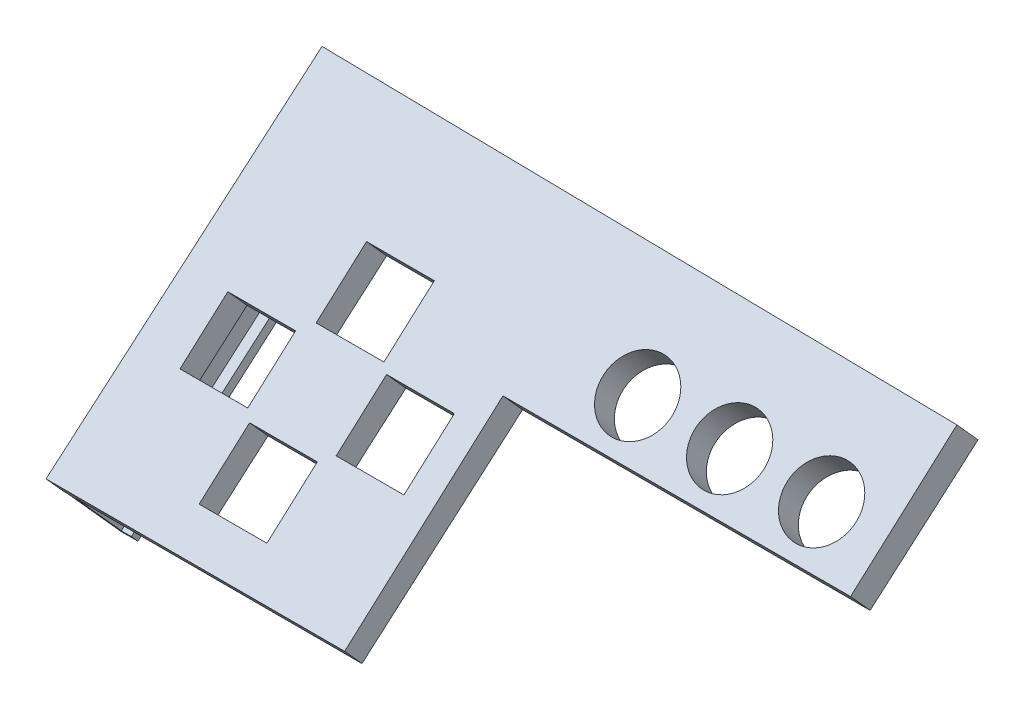
ISO-10303-21;
HEADER;
FILE_DESCRIPTION(('STEP AP214'),'2;1');
FILE_NAME('part.step','',(''),(''),'','','');
FILE_SCHEMA(('AUTOMOTIVE_DESIGN { 1 0 10303 214 1 1 1 1 }'));
ENDSEC;
DATA;
#1=APPLICATION_CONTEXT('core data for automotive mechanical design processes');
#2=APPLICATION_PROTOCOL_DEFINITION('international standard','automotive_design',2000,#1);
#3=PRODUCT_CONTEXT('',#1,'mechanical');
#4=PRODUCT('Part','Part','',(#3));
#5=PRODUCT_RELATED_PRODUCT_CATEGORY('part','',(#4));
#6=PRODUCT_DEFINITION_FORMATION('','',#4);
#7=PRODUCT_DEFINITION_CONTEXT('part definition',#1,'design');
#8=PRODUCT_DEFINITION('design','',#6,#7);
#9=PRODUCT_DEFINITION_SHAPE('','',#8);
#10=(LENGTH_UNIT() NAMED_UNIT(*) SI_UNIT(.MILLI.,.METRE.));
#11=(NAMED_UNIT(*) PLANE_ANGLE_UNIT() SI_UNIT($,.RADIAN.));
#12=(NAMED_UNIT(*) SI_UNIT($,.STERADIAN.) SOLID_ANGLE_UNIT());
#13=UNCERTAINTY_MEASURE_WITH_UNIT(LENGTH_MEASURE(1.E-05),#10,'distance_accuracy_value','');
#14=(GEOMETRIC_REPRESENTATION_CONTEXT(3) GLOBAL_UNCERTAINTY_ASSIGNED_CONTEXT((#13)) GLOBAL_UNIT_ASSIGNED_CONTEXT((#10,
#11,#12)) REPRESENTATION_CONTEXT('',''));
#15=CARTESIAN_POINT('',(0.,0.,0.));
#16=DIRECTION('',(0.,0.,1.));
#17=DIRECTION('',(1.,0.,0.));
#18=AXIS2_PLACEMENT_3D('',#15,#16,#17);
#19=CARTESIAN_POINT('',(253.811392064802,66.7836197317114,88.641700653962));
#20=DIRECTION('',(0.,0.754738656539461,0.656025579017319));
#21=DIRECTION('',(0.,-0.656025579017319,0.754738656539462));
#22=AXIS2_PLACEMENT_3D('',#19,#20,#21);
#23=PLANE('',#22);
#24=DIRECTION('',(-0.0161096728568578,-0.655940447102882,0.754640714707944));
#25=VECTOR('',#24,1.);
#26=CARTESIAN_POINT('',(184.643368262529,67.514707004922,87.8006056661377));
#27=LINE('',#26,#25);
#28=CARTESIAN_POINT('',(184.37843120733,56.7272172783893,100.21130391335));
#29=VERTEX_POINT('',#28);
#30=CARTESIAN_POINT('',(183.933086898354,38.594052952829,121.072990590847));
#31=VERTEX_POINT('',#30);
#32=EDGE_CURVE('E268',#29,#31,#27,.T.);
#33=ORIENTED_EDGE('',*,*,#32,.F.);
#34=DIRECTION('',(0.,0.656025579017319,-0.754738656539461));
#35=VECTOR('',#34,1.);
#36=CARTESIAN_POINT('',(184.37843120733,30.4009789206237,130.498887820734));
#37=LINE('',#36,#35);
#38=CARTESIAN_POINT('',(184.37843120733,38.5387104513235,121.136660555207));
#39=VERTEX_POINT('',#38);
#40=EDGE_CURVE('E435',#39,#29,#37,.T.);
#41=ORIENTED_EDGE('',*,*,#40,.F.);
#42=DIRECTION('',(1.,0.,0.));
#43=VECTOR('',#42,1.);
#44=CARTESIAN_POINT('',(253.811392064802,38.5387104513235,121.136660555207));
#45=LINE('',#44,#43);
#46=CARTESIAN_POINT('',(183.932173865189,38.5387104513235,121.136660555207));
#47=VERTEX_POINT('',#46);
#48=EDGE_CURVE('E275',#47,#39,#45,.T.);
#49=ORIENTED_EDGE('',*,*,#48,.F.);
#50=DIRECTION('',(-0.0108223881525253,-0.655987159694383,0.75469445620779));
#51=VECTOR('',#50,1.);
#52=CARTESIAN_POINT('',(184.406284551071,67.2764084371243,88.0747613494943));
#53=LINE('',#52,#51);
#54=EDGE_CURVE('E306',#31,#47,#53,.T.);
#55=ORIENTED_EDGE('',*,*,#54,.F.);
#56=EDGE_LOOP('',(#33,#41,#49,#55));
#57=FACE_BOUND('',#56,.T.);
#58=ADVANCED_FACE('F46',(#57),#23,.F.);
#59=CARTESIAN_POINT('',(251.62843120733,31.4929526378121,129.242603305851));
#60=DIRECTION('',(0.,0.754738656539461,0.656025579017319));
#61=DIRECTION('',(0.,-0.656025579017319,0.754738656539462));
#62=AXIS2_PLACEMENT_3D('',#59,#60,#61);
#63=PLANE('',#62);
#64=CARTESIAN_POINT('',(233.445359997497,55.8234951262214,101.251010389481));
#65=DIRECTION('',(0.,0.754738656539461,0.656025579017319));
#66=DIRECTION('',(0.,-0.656025579017319,0.754738656539462));
#67=AXIS2_PLACEMENT_3D('',#64,#65,#66);
#68=ELLIPSE('',#67,3.50043164958809,3.50000000000002);
#69=CARTESIAN_POINT('',(233.445359997497,53.5271224264898,103.89292147));
#70=VERTEX_POINT('',#69);
#71=EDGE_CURVE('E348',#70,#70,#68,.F.);
#72=ORIENTED_EDGE('',*,*,#71,.F.);
#73=EDGE_LOOP('',(#72));
#74=FACE_BOUND('',#73,.T.);
#75=DIRECTION('',(-1.,0.,0.));
#76=VECTOR('',#75,1.);
#77=CARTESIAN_POINT('',(253.811392064802,50.4249263144399,107.461909327817));
#78=LINE('',#77,#76);
#79=CARTESIAN_POINT('',(195.683649821769,50.4249263144399,107.461909327817));
#80=VERTEX_POINT('',#79);
#81=CARTESIAN_POINT('',(188.833649821769,50.4249263144399,107.461909327817));
#82=VERTEX_POINT('',#81);
#83=EDGE_CURVE('E318',#80,#82,#78,.T.);
#84=ORIENTED_EDGE('',*,*,#83,.T.);
#85=DIRECTION('',(0.,-0.656025579017319,0.754738656539462));
#86=VECTOR('',#85,1.);
#87=CARTESIAN_POINT('',(188.833649821769,66.7836197317114,88.641700653962));
#88=LINE('',#87,#86);
#89=CARTESIAN_POINT('',(188.833649821769,46.1602341577956,112.368315620208));
#90=VERTEX_POINT('',#89);
#91=EDGE_CURVE('E316',#82,#90,#88,.T.);
#92=ORIENTED_EDGE('',*,*,#91,.T.);
#93=DIRECTION('',(1.,0.,0.));
#94=VECTOR('',#93,1.);
#95=CARTESIAN_POINT('',(253.811392064802,46.1602341577956,112.368315620208));
#96=LINE('',#95,#94);
#97=CARTESIAN_POINT('',(195.683649821769,46.1602341577956,112.368315620208));
#98=VERTEX_POINT('',#97);
#99=EDGE_CURVE('E314',#90,#98,#96,.T.);
#100=ORIENTED_EDGE('',*,*,#99,.T.);
#101=DIRECTION('',(0.,0.656025579017319,-0.754738656539462));
#102=VECTOR('',#101,1.);
#103=CARTESIAN_POINT('',(195.683649821769,66.7836197317114,88.641700653962));
#104=LINE('',#103,#102);
#105=EDGE_CURVE('E311',#98,#80,#104,.T.);
#106=ORIENTED_EDGE('',*,*,#105,.T.);
#107=EDGE_LOOP('',(#84,#92,#100,#106));
#108=FACE_BOUND('',#107,.T.);
#109=CARTESIAN_POINT('',(224.145359997497,55.8234951262214,101.251010389481));
#110=DIRECTION('',(0.,0.754738656539461,0.656025579017319));
#111=DIRECTION('',(0.,-0.656025579017319,0.754738656539462));
#112=AXIS2_PLACEMENT_3D('',#109,#110,#111);
#113=ELLIPSE('',#112,3.50043164958812,3.50000000000005);
#114=CARTESIAN_POINT('',(224.145359997497,53.5271224264898,103.89292147));
#115=VERTEX_POINT('',#114);
#116=EDGE_CURVE('E396',#115,#115,#113,.F.);
#117=ORIENTED_EDGE('',*,*,#116,.F.);
#118=EDGE_LOOP('',(#117));
#119=FACE_BOUND('',#118,.T.);
#120=DIRECTION('',(1.,0.,0.));
#121=VECTOR('',#120,1.);
#122=CARTESIAN_POINT('',(253.811392064802,41.1082142183861,118.180519997348));
#123=LINE('',#122,#121);
#124=CARTESIAN_POINT('',(196.499532192024,41.1082142183861,118.180519997348));
#125=VERTEX_POINT('',#124);
#126=CARTESIAN_POINT('',(203.349532192024,41.1082142183862,118.180519997348));
#127=VERTEX_POINT('',#126);
#128=EDGE_CURVE('E313',#125,#127,#123,.T.);
#129=ORIENTED_EDGE('',*,*,#128,.T.);
#130=DIRECTION('',(0.,0.656025579017319,-0.754738656539462));
#131=VECTOR('',#130,1.);
#132=CARTESIAN_POINT('',(203.349532192024,66.7836197317114,88.641700653962));
#133=LINE('',#132,#131);
#134=CARTESIAN_POINT('',(203.349532192024,45.6025436450036,113.009922596905));
#135=VERTEX_POINT('',#134);
#136=EDGE_CURVE('E326',#127,#135,#133,.T.);
#137=ORIENTED_EDGE('',*,*,#136,.T.);
#138=DIRECTION('',(-1.,0.,0.));
#139=VECTOR('',#138,1.);
#140=CARTESIAN_POINT('',(253.811392064802,45.6025436450036,113.009922596905));
#141=LINE('',#140,#139);
#142=CARTESIAN_POINT('',(196.499532192024,45.6025436450036,113.009922596905));
#143=VERTEX_POINT('',#142);
#144=EDGE_CURVE('E324',#135,#143,#141,.T.);
#145=ORIENTED_EDGE('',*,*,#144,.T.);
#146=DIRECTION('',(0.,-0.656025579017319,0.754738656539462));
#147=VECTOR('',#146,1.);
#148=CARTESIAN_POINT('',(196.499532192024,66.7836197317114,88.641700653962));
#149=LINE('',#148,#147);
#150=EDGE_CURVE('E321',#143,#125,#149,.T.);
#151=ORIENTED_EDGE('',*,*,#150,.T.);
#152=EDGE_LOOP('',(#129,#137,#145,#151));
#153=FACE_BOUND('',#152,.T.);
#154=DIRECTION('',(-1.,0.,0.));
#155=VECTOR('',#154,1.);
#156=CARTESIAN_POINT('',(253.811392064802,50.7857848815406,107.046751872307));
#157=LINE('',#156,#155);
#158=CARTESIAN_POINT('',(211.324532192024,50.7857848815406,107.046751872307));
#159=VERTEX_POINT('',#158);
#160=CARTESIAN_POINT('',(204.474532192024,50.7857848815406,107.046751872307));
#161=VERTEX_POINT('',#160);
#162=EDGE_CURVE('E323',#159,#161,#157,.T.);
#163=ORIENTED_EDGE('',*,*,#162,.T.);
#164=DIRECTION('',(0.,-0.656025579017319,0.754738656539462));
#165=VECTOR('',#164,1.);
#166=CARTESIAN_POINT('',(204.474532192024,66.7836197317114,88.641700653962));
#167=LINE('',#166,#165);
#168=CARTESIAN_POINT('',(204.474532192024,46.2914554549231,112.21734927275));
#169=VERTEX_POINT('',#168);
#170=EDGE_CURVE('E334',#161,#169,#167,.T.);
#171=ORIENTED_EDGE('',*,*,#170,.T.);
#172=DIRECTION('',(1.,0.,0.));
#173=VECTOR('',#172,1.);
#174=CARTESIAN_POINT('',(253.811392064802,46.2914554549231,112.21734927275));
#175=LINE('',#174,#173);
#176=CARTESIAN_POINT('',(211.324532192024,46.2914554549231,112.21734927275));
#177=VERTEX_POINT('',#176);
#178=EDGE_CURVE('E332',#169,#177,#175,.T.);
#179=ORIENTED_EDGE('',*,*,#178,.T.);
#180=DIRECTION('',(0.,0.656025579017319,-0.754738656539462));
#181=VECTOR('',#180,1.);
#182=CARTESIAN_POINT('',(211.324532192024,66.7836197317114,88.641700653962));
#183=LINE('',#182,#181);
#184=EDGE_CURVE('E329',#177,#159,#183,.T.);
#185=ORIENTED_EDGE('',*,*,#184,.T.);
#186=EDGE_LOOP('',(#163,#171,#179,#185));
#187=FACE_BOUND('',#186,.T.);
#188=DIRECTION('',(1.,0.,0.));
#189=VECTOR('',#188,1.);
#190=CARTESIAN_POINT('',(253.811392064802,51.228656759346,106.537240449636));
#191=LINE('',#190,#189);
#192=CARTESIAN_POINT('',(196.849532192024,51.228656759346,106.537240449636));
#193=VERTEX_POINT('',#192);
#194=CARTESIAN_POINT('',(203.699532192024,51.228656759346,106.537240449636));
#195=VERTEX_POINT('',#194);
#196=EDGE_CURVE('E331',#193,#195,#191,.T.);
#197=ORIENTED_EDGE('',*,*,#196,.T.);
#198=DIRECTION('',(0.,0.656025579017319,-0.754738656539462));
#199=VECTOR('',#198,1.);
#200=CARTESIAN_POINT('',(203.699532192024,66.7836197317114,88.641700653962));
#201=LINE('',#200,#199);
#202=CARTESIAN_POINT('',(203.699532192024,55.7229861859635,101.366643049193));
#203=VERTEX_POINT('',#202);
#204=EDGE_CURVE('E342',#195,#203,#201,.T.);
#205=ORIENTED_EDGE('',*,*,#204,.T.);
#206=DIRECTION('',(-1.,0.,0.));
#207=VECTOR('',#206,1.);
#208=CARTESIAN_POINT('',(253.811392064802,55.7229861859635,101.366643049193));
#209=LINE('',#208,#207);
#210=CARTESIAN_POINT('',(196.849532192024,55.7229861859635,101.366643049193));
#211=VERTEX_POINT('',#210);
#212=EDGE_CURVE('E340',#203,#211,#209,.T.);
#213=ORIENTED_EDGE('',*,*,#212,.T.);
#214=DIRECTION('',(0.,-0.656025579017319,0.754738656539462));
#215=VECTOR('',#214,1.);
#216=CARTESIAN_POINT('',(196.849532192024,66.7836197317114,88.641700653962));
#217=LINE('',#216,#215);
#218=EDGE_CURVE('E337',#211,#193,#217,.T.);
#219=ORIENTED_EDGE('',*,*,#218,.T.);
#220=EDGE_LOOP('',(#197,#205,#213,#219));
#221=FACE_BOUND('',#220,.T.);
#222=CARTESIAN_POINT('',(242.745359997497,55.8234951262214,101.251010389481));
#223=DIRECTION('',(0.,0.754738656539461,0.656025579017319));
#224=DIRECTION('',(0.,-0.656025579017319,0.754738656539462));
#225=AXIS2_PLACEMENT_3D('',#222,#223,#224);
#226=ELLIPSE('',#225,3.50043164958818,3.50000000000011);
#227=CARTESIAN_POINT('',(242.745359997496,53.5271224264897,103.89292147));
#228=VERTEX_POINT('',#227);
#229=EDGE_CURVE('E56',#228,#228,#226,.F.);
#230=ORIENTED_EDGE('',*,*,#229,.F.);
#231=EDGE_LOOP('',(#230));
#232=FACE_BOUND('',#231,.T.);
#233=DIRECTION('',(-0.999935115920679,0.00747304847752896,-0.00859752843270607));
#234=VECTOR('',#233,1.);
#235=CARTESIAN_POINT('',(252.160112408158,62.1102513995226,94.0182771920807));
#236=LINE('',#235,#234);
#237=CARTESIAN_POINT('',(249.267868371204,62.1318666819073,93.9934094282167));
#238=VERTEX_POINT('',#237);
#239=CARTESIAN_POINT('',(185.12843120733,62.6112149072227,93.441933011503));
#240=VERTEX_POINT('',#239);
#241=EDGE_CURVE('E304',#238,#240,#236,.T.);
#242=ORIENTED_EDGE('',*,*,#241,.F.);
#243=DIRECTION('',(0.,0.656025579017319,-0.754738656539462));
#244=VECTOR('',#243,1.);
#245=CARTESIAN_POINT('',(249.267868371204,31.4929526378121,129.242603305851));
#246=LINE('',#245,#244);
#247=CARTESIAN_POINT('',(249.267868371204,52.6506336429939,104.901296734754));
#248=VERTEX_POINT('',#247);
#249=EDGE_CURVE('E293',#248,#238,#246,.T.);
#250=ORIENTED_EDGE('',*,*,#249,.F.);
#251=DIRECTION('',(1.,0.,0.));
#252=VECTOR('',#251,1.);
#253=CARTESIAN_POINT('',(251.62843120733,52.6506336429939,104.901296734754));
#254=LINE('',#253,#252);
#255=CARTESIAN_POINT('',(214.126263471792,52.6506336429939,104.901296734754));
#256=VERTEX_POINT('',#255);
#257=EDGE_CURVE('E291',#256,#248,#254,.T.);
#258=ORIENTED_EDGE('',*,*,#257,.F.);
#259=DIRECTION('',(0.,0.656025579017319,-0.754738656539462));
#260=VECTOR('',#259,1.);
#261=CARTESIAN_POINT('',(214.126263471792,31.4929526378121,129.242603305851));
#262=LINE('',#261,#260);
#263=CARTESIAN_POINT('',(214.126263471792,38.5387104513235,121.136660555207));
#264=VERTEX_POINT('',#263);
#265=EDGE_CURVE('E289',#264,#256,#262,.T.);
#266=ORIENTED_EDGE('',*,*,#265,.F.);
#267=DIRECTION('',(1.,0.,0.));
#268=VECTOR('',#267,1.);
#269=CARTESIAN_POINT('',(251.62843120733,38.5387104513234,121.136660555207));
#270=LINE('',#269,#268);
#271=CARTESIAN_POINT('',(185.12843120733,38.5387104513235,121.136660555207));
#272=VERTEX_POINT('',#271);
#273=EDGE_CURVE('E236',#272,#264,#270,.T.);
#274=ORIENTED_EDGE('',*,*,#273,.F.);
#275=DIRECTION('',(0.,0.656025579017319,-0.754738656539461));
#276=VECTOR('',#275,1.);
#277=CARTESIAN_POINT('',(185.12843120733,31.4929526378122,129.242603305851));
#278=LINE('',#277,#276);
#279=EDGE_CURVE('E320',#272,#240,#278,.T.);
#280=ORIENTED_EDGE('',*,*,#279,.T.);
#281=EDGE_LOOP('',(#242,#250,#258,#266,#274,#280));
#282=FACE_BOUND('',#281,.T.);
#283=ADVANCED_FACE('F48',(#74,#108,#119,#153,#187,#221,#232,#282),#63,.F.);
#284=CARTESIAN_POINT('',(184.37843120733,24.363069668308,125.250683188596));
#285=DIRECTION('',(1.,0.,0.));
#286=DIRECTION('',(0.,1.,0.));
#287=AXIS2_PLACEMENT_3D('',#284,#285,#286);
#288=PLANE('',#287);
#289=DIRECTION('',(0.,0.744343452030954,0.667796994167122));
#290=VECTOR('',#289,1.);
#291=CARTESIAN_POINT('',(184.37843120733,51.2422850035894,95.2904286422275));
#292=LINE('',#291,#290);
#293=CARTESIAN_POINT('',(184.37843120733,50.7717352723253,94.8682690930478));
#294=VERTEX_POINT('',#293);
#295=EDGE_CURVE('E270',#294,#29,#292,.T.);
#296=ORIENTED_EDGE('',*,*,#295,.F.);
#297=DIRECTION('',(0.,0.656025579017319,-0.754738656539461));
#298=VECTOR('',#297,1.);
#299=CARTESIAN_POINT('',(184.37843120733,24.363069668308,125.250683188596));
#300=LINE('',#299,#298);
#301=CARTESIAN_POINT('',(184.37843120733,32.58322844526,115.793625734905));
#302=VERTEX_POINT('',#301);
#303=EDGE_CURVE('E439',#302,#294,#300,.T.);
#304=ORIENTED_EDGE('',*,*,#303,.F.);
#305=DIRECTION('',(0.,-0.74434345203095,-0.667796994167126));
#306=VECTOR('',#305,1.);
#307=CARTESIAN_POINT('',(184.37843120733,32.7296952740442,115.925030273684));
#308=LINE('',#307,#306);
#309=EDGE_CURVE('E277',#39,#302,#308,.T.);
#310=ORIENTED_EDGE('',*,*,#309,.F.);
#311=ORIENTED_EDGE('',*,*,#40,.T.);
#312=EDGE_LOOP('',(#296,#304,#310,#311));
#313=FACE_BOUND('',#312,.T.);
#314=ADVANCED_FACE('F487',(#313),#288,.F.);
#315=CARTESIAN_POINT('',(185.12843120733,26.2097820420359,124.650424252729));
#316=DIRECTION('',(-1.,0.,0.));
#317=DIRECTION('',(0.,0.,1.));
#318=AXIS2_PLACEMENT_3D('',#315,#316,#317);
#319=PLANE('',#318);
#320=DIRECTION('',(0.,-0.74434345203095,-0.667796994167126));
#321=VECTOR('',#320,1.);
#322=CARTESIAN_POINT('',(185.12843120733,57.9559186022465,89.2653759786735));
#323=LINE('',#322,#321);
#324=CARTESIAN_POINT('',(185.12843120733,57.4001681519171,88.7667775437382));
#325=VERTEX_POINT('',#324);
#326=EDGE_CURVE('E302',#240,#325,#323,.T.);
#327=ORIENTED_EDGE('',*,*,#326,.F.);
#328=ORIENTED_EDGE('',*,*,#279,.F.);
#329=DIRECTION('',(0.,0.74434345203095,0.667796994167126));
#330=VECTOR('',#329,1.);
#331=CARTESIAN_POINT('',(185.12843120733,33.454490145702,116.575289015613));
#332=LINE('',#331,#330);
#333=CARTESIAN_POINT('',(185.12843120733,33.3276636960179,116.461505087443));
#334=VERTEX_POINT('',#333);
#335=EDGE_CURVE('E286',#334,#272,#332,.T.);
#336=ORIENTED_EDGE('',*,*,#335,.F.);
#337=DIRECTION('',(0.,0.656025579017319,-0.754738656539461));
#338=VECTOR('',#337,1.);
#339=CARTESIAN_POINT('',(185.12843120733,26.2097820420359,124.650424252729));
#340=LINE('',#339,#338);
#341=EDGE_CURVE('E438',#334,#325,#340,.T.);
#342=ORIENTED_EDGE('',*,*,#341,.T.);
#343=EDGE_LOOP('',(#327,#328,#336,#342));
#344=FACE_BOUND('',#343,.T.);
#345=ADVANCED_FACE('F463',(#344),#319,.F.);
#346=CARTESIAN_POINT('',(0.,75.8930493391236,65.9669161036081));
#347=DIRECTION('',(0.,-0.754738656539462,-0.656025579017319));
#348=DIRECTION('',(0.,0.656025579017319,-0.754738656539461));
#349=AXIS2_PLACEMENT_3D('',#346,#347,#348);
#350=PLANE('',#349);
#351=ORIENTED_EDGE('',*,*,#303,.T.);
#352=DIRECTION('',(0.0161096728568578,0.655940447102882,-0.754640714707944));
#353=VECTOR('',#352,1.);
#354=CARTESIAN_POINT('',(184.947391786695,73.9382055122237,68.2159079887551));
#355=LINE('',#354,#353);
#356=CARTESIAN_POINT('',(184.523051290964,56.6602572281783,88.0936930824282));
#357=VERTEX_POINT('',#356);
#358=EDGE_CURVE('E272',#294,#357,#355,.T.);
#359=ORIENTED_EDGE('',*,*,#358,.T.);
#360=DIRECTION('',(0.999935115920679,-0.00747304847752862,0.00859752843270638));
#361=VECTOR('',#360,1.);
#362=CARTESIAN_POINT('',(-0.309997073347829,58.0416131868638,86.5044825793519));
#363=LINE('',#362,#361);
#364=CARTESIAN_POINT('',(186.12843120733,56.6482593677683,88.107496277512));
#365=VERTEX_POINT('',#364);
#366=EDGE_CURVE('E299',#357,#365,#363,.T.);
#367=ORIENTED_EDGE('',*,*,#366,.T.);
#368=DIRECTION('',(0.,0.656025579017319,-0.754738656539461));
#369=VECTOR('',#368,1.);
#370=CARTESIAN_POINT('',(186.12843120733,25.4550433854965,123.994398673712));
#371=LINE('',#370,#369);
#372=CARTESIAN_POINT('',(186.12843120733,32.5832284452601,115.793625734905));
#373=VERTEX_POINT('',#372);
#374=EDGE_CURVE('E442',#373,#365,#371,.T.);
#375=ORIENTED_EDGE('',*,*,#374,.F.);
#376=DIRECTION('',(-1.,0.,0.));
#377=VECTOR('',#376,1.);
#378=CARTESIAN_POINT('',(0.,32.5832284452601,115.793625734905));
#379=LINE('',#378,#377);
#380=EDGE_CURVE('E279',#373,#302,#379,.T.);
#381=ORIENTED_EDGE('',*,*,#380,.T.);
#382=EDGE_LOOP('',(#351,#359,#367,#375,#381));
#383=FACE_BOUND('',#382,.T.);
#384=ADVANCED_FACE('F480',(#383),#350,.T.);
#385=CARTESIAN_POINT('',(186.12843120733,26.2097820420359,124.650424252729));
#386=DIRECTION('',(-1.,0.,0.));
#387=DIRECTION('',(0.,0.,1.));
#388=AXIS2_PLACEMENT_3D('',#385,#386,#387);
#389=PLANE('',#388);
#390=DIRECTION('',(0.,-0.74434345203095,-0.667796994167126));
#391=VECTOR('',#390,1.);
#392=CARTESIAN_POINT('',(186.12843120733,57.9483119054016,89.2738545957346));
#393=LINE('',#392,#391);
#394=CARTESIAN_POINT('',(186.12843120733,57.3926946185262,88.7753756300498));
#395=VERTEX_POINT('',#394);
#396=EDGE_CURVE('E297',#395,#365,#393,.T.);
#397=ORIENTED_EDGE('',*,*,#396,.F.);
#398=DIRECTION('',(0.,0.656025579017319,-0.754738656539461));
#399=VECTOR('',#398,1.);
#400=CARTESIAN_POINT('',(186.12843120733,26.2097820420359,124.650424252729));
#401=LINE('',#400,#399);
#402=CARTESIAN_POINT('',(186.12843120733,33.3276636960179,116.461505087443));
#403=VERTEX_POINT('',#402);
#404=EDGE_CURVE('E310',#403,#395,#401,.T.);
#405=ORIENTED_EDGE('',*,*,#404,.F.);
#406=DIRECTION('',(0.,0.74434345203095,0.667796994167126));
#407=VECTOR('',#406,1.);
#408=CARTESIAN_POINT('',(186.12843120733,33.454490145702,116.575289015613));
#409=LINE('',#408,#407);
#410=EDGE_CURVE('E282',#373,#403,#409,.T.);
#411=ORIENTED_EDGE('',*,*,#410,.F.);
#412=ORIENTED_EDGE('',*,*,#374,.T.);
#413=EDGE_LOOP('',(#397,#405,#411,#412));
#414=FACE_BOUND('',#413,.T.);
#415=ADVANCED_FACE('F476',(#414),#389,.F.);
#416=CARTESIAN_POINT('',(186.12843120733,26.2097820420359,124.650424252729));
#417=DIRECTION('',(0.,-0.754738656539461,-0.656025579017319));
#418=DIRECTION('',(0.,0.656025579017319,-0.754738656539462));
#419=AXIS2_PLACEMENT_3D('',#416,#417,#418);
#420=PLANE('',#419);
#421=DIRECTION('',(0.999935115920679,-0.0074730484775285,0.00859752843270648));
#422=VECTOR('',#421,1.);
#423=CARTESIAN_POINT('',(186.669864242579,57.3886482006584,88.7800309180188));
#424=LINE('',#423,#422);
#425=EDGE_CURVE('E295',#325,#395,#424,.T.);
#426=ORIENTED_EDGE('',*,*,#425,.F.);
#427=ORIENTED_EDGE('',*,*,#341,.F.);
#428=DIRECTION('',(-1.,0.,0.));
#429=VECTOR('',#428,1.);
#430=CARTESIAN_POINT('',(186.12843120733,33.3276636960179,116.461505087443));
#431=LINE('',#430,#429);
#432=EDGE_CURVE('E284',#403,#334,#431,.T.);
#433=ORIENTED_EDGE('',*,*,#432,.F.);
#434=ORIENTED_EDGE('',*,*,#404,.T.);
#435=EDGE_LOOP('',(#426,#427,#433,#434));
#436=FACE_BOUND('',#435,.T.);
#437=ADVANCED_FACE('F471',(#436),#420,.F.);
#438=CARTESIAN_POINT('',(268.702327491549,70.,90.));
#439=DIRECTION('',(0.,0.74434345203095,0.667796994167126));
#440=DIRECTION('',(0.,-0.667796994167126,0.74434345203095));
#441=AXIS2_PLACEMENT_3D('',#438,#439,#440);
#442=PLANE('',#441);
#443=CARTESIAN_POINT('',(242.745359997497,58.0854042635442,103.280310330069));
#444=DIRECTION('',(0.,0.74434345203095,0.667796994167126));
#445=DIRECTION('',(0.,-0.667796994167126,0.74434345203095));
#446=AXIS2_PLACEMENT_3D('',#443,#444,#445);
#447=CIRCLE('',#446,3.50000000000011);
#448=CARTESIAN_POINT('',(242.745359997497,55.7481147839592,105.885512412177));
#449=VERTEX_POINT('',#448);
#450=EDGE_CURVE('E345',#449,#449,#447,.T.);
#451=ORIENTED_EDGE('',*,*,#450,.F.);
#452=EDGE_LOOP('',(#451));
#453=FACE_BOUND('',#452,.T.);
#454=CARTESIAN_POINT('',(233.445359997497,58.0854042635442,103.280310330069));
#455=DIRECTION('',(0.,0.74434345203095,0.667796994167126));
#456=DIRECTION('',(0.,-0.667796994167126,0.74434345203095));
#457=AXIS2_PLACEMENT_3D('',#454,#455,#456);
#458=CIRCLE('',#457,3.50000000000002);
#459=CARTESIAN_POINT('',(233.445359997497,55.7481147839593,105.885512412177));
#460=VERTEX_POINT('',#459);
#461=EDGE_CURVE('E349',#460,#460,#458,.T.);
#462=ORIENTED_EDGE('',*,*,#461,.F.);
#463=EDGE_LOOP('',(#462));
#464=FACE_BOUND('',#463,.T.);
#465=DIRECTION('',(0.,-0.667796994167126,0.74434345203095));
#466=VECTOR('',#465,1.);
#467=CARTESIAN_POINT('',(196.849532192024,53.4086950444586,108.49308893597));
#468=LINE('',#467,#466);
#469=CARTESIAN_POINT('',(196.849532192024,57.9831044545034,103.394336289558));
#470=VERTEX_POINT('',#469);
#471=CARTESIAN_POINT('',(196.849532192024,53.4086950444586,108.49308893597));
#472=VERTEX_POINT('',#471);
#473=EDGE_CURVE('E352',#470,#472,#468,.T.);
#474=ORIENTED_EDGE('',*,*,#473,.F.);
#475=DIRECTION('',(-1.,0.,0.));
#476=VECTOR('',#475,1.);
#477=CARTESIAN_POINT('',(196.849532192024,57.9831044545034,103.394336289558));
#478=LINE('',#477,#476);
#479=CARTESIAN_POINT('',(203.699532192024,57.9831044545034,103.394336289558));
#480=VERTEX_POINT('',#479);
#481=EDGE_CURVE('E385',#480,#470,#478,.T.);
#482=ORIENTED_EDGE('',*,*,#481,.F.);
#483=DIRECTION('',(0.,0.667796994167126,-0.74434345203095));
#484=VECTOR('',#483,1.);
#485=CARTESIAN_POINT('',(203.699532192024,53.4086950444586,108.49308893597));
#486=LINE('',#485,#484);
#487=CARTESIAN_POINT('',(203.699532192024,53.4086950444586,108.49308893597));
#488=VERTEX_POINT('',#487);
#489=EDGE_CURVE('E381',#488,#480,#486,.T.);
#490=ORIENTED_EDGE('',*,*,#489,.F.);
#491=DIRECTION('',(1.,0.,0.));
#492=VECTOR('',#491,1.);
#493=CARTESIAN_POINT('',(196.849532192024,53.4086950444586,108.49308893597));
#494=LINE('',#493,#492);
#495=EDGE_CURVE('E377',#472,#488,#494,.T.);
#496=ORIENTED_EDGE('',*,*,#495,.F.);
#497=EDGE_LOOP('',(#474,#482,#490,#496));
#498=FACE_BOUND('',#497,.T.);
#499=DIRECTION('',(0.,0.667796994167127,-0.74434345203095));
#500=VECTOR('',#499,1.);
#501=CARTESIAN_POINT('',(211.324532192024,52.9579320733958,108.995520766091));
#502=LINE('',#501,#500);
#503=CARTESIAN_POINT('',(211.324532192024,48.383522663351,114.094273412503));
#504=VERTEX_POINT('',#503);
#505=CARTESIAN_POINT('',(211.324532192024,52.9579320733958,108.995520766091));
#506=VERTEX_POINT('',#505);
#507=EDGE_CURVE('E353',#504,#506,#502,.T.);
#508=ORIENTED_EDGE('',*,*,#507,.F.);
#509=DIRECTION('',(1.,0.,0.));
#510=VECTOR('',#509,1.);
#511=CARTESIAN_POINT('',(211.324532192024,48.383522663351,114.094273412503));
#512=LINE('',#511,#510);
#513=CARTESIAN_POINT('',(204.474532192024,48.383522663351,114.094273412503));
#514=VERTEX_POINT('',#513);
#515=EDGE_CURVE('E366',#514,#504,#512,.T.);
#516=ORIENTED_EDGE('',*,*,#515,.F.);
#517=DIRECTION('',(0.,-0.667796994167127,0.74434345203095));
#518=VECTOR('',#517,1.);
#519=CARTESIAN_POINT('',(204.474532192024,52.9579320733958,108.995520766091));
#520=LINE('',#519,#518);
#521=CARTESIAN_POINT('',(204.474532192024,52.9579320733958,108.995520766091));
#522=VERTEX_POINT('',#521);
#523=EDGE_CURVE('E362',#522,#514,#520,.T.);
#524=ORIENTED_EDGE('',*,*,#523,.F.);
#525=DIRECTION('',(-1.,0.,0.));
#526=VECTOR('',#525,1.);
#527=CARTESIAN_POINT('',(211.324532192024,52.9579320733958,108.995520766091));
#528=LINE('',#527,#526);
#529=EDGE_CURVE('E357',#506,#522,#528,.T.);
#530=ORIENTED_EDGE('',*,*,#529,.F.);
#531=EDGE_LOOP('',(#508,#516,#524,#530));
#532=FACE_BOUND('',#531,.T.);
#533=DIRECTION('',(0.,-0.667796994167125,0.744343452030951));
#534=VECTOR('',#533,1.);
#535=CARTESIAN_POINT('',(196.499532192024,47.6823358194755,114.875834037135));
#536=LINE('',#535,#534);
#537=CARTESIAN_POINT('',(196.499532192024,47.6823358194755,114.875834037135));
#538=VERTEX_POINT('',#537);
#539=CARTESIAN_POINT('',(196.499532192024,43.1079264094307,119.974586683547));
#540=VERTEX_POINT('',#539);
#541=EDGE_CURVE('E374',#538,#540,#536,.T.);
#542=ORIENTED_EDGE('',*,*,#541,.F.);
#543=DIRECTION('',(-1.,0.,0.));
#544=VECTOR('',#543,1.);
#545=CARTESIAN_POINT('',(196.499532192024,47.6823358194755,114.875834037135));
#546=LINE('',#545,#544);
#547=CARTESIAN_POINT('',(203.349532192024,47.6823358194755,114.875834037135));
#548=VERTEX_POINT('',#547);
#549=EDGE_CURVE('E409',#548,#538,#546,.T.);
#550=ORIENTED_EDGE('',*,*,#549,.F.);
#551=DIRECTION('',(0.,0.667796994167125,-0.744343452030951));
#552=VECTOR('',#551,1.);
#553=CARTESIAN_POINT('',(203.349532192024,47.6823358194755,114.875834037135));
#554=LINE('',#553,#552);
#555=CARTESIAN_POINT('',(203.349532192024,43.1079264094307,119.974586683547));
#556=VERTEX_POINT('',#555);
#557=EDGE_CURVE('E405',#556,#548,#554,.T.);
#558=ORIENTED_EDGE('',*,*,#557,.F.);
#559=DIRECTION('',(1.,0.,0.));
#560=VECTOR('',#559,1.);
#561=CARTESIAN_POINT('',(196.499532192024,43.1079264094307,119.974586683547));
#562=LINE('',#561,#560);
#563=EDGE_CURVE('E400',#540,#556,#562,.T.);
#564=ORIENTED_EDGE('',*,*,#563,.F.);
#565=EDGE_LOOP('',(#542,#550,#558,#564));
#566=FACE_BOUND('',#565,.T.);
#567=CARTESIAN_POINT('',(224.145359997497,58.0854042635442,103.280310330069));
#568=DIRECTION('',(0.,0.74434345203095,0.667796994167126));
#569=DIRECTION('',(0.,-0.667796994167126,0.74434345203095));
#570=AXIS2_PLACEMENT_3D('',#567,#568,#569);
#571=CIRCLE('',#570,3.50000000000005);
#572=CARTESIAN_POINT('',(224.145359997497,55.7481147839593,105.885512412177));
#573=VERTEX_POINT('',#572);
#574=EDGE_CURVE('E393',#573,#573,#571,.T.);
#575=ORIENTED_EDGE('',*,*,#574,.F.);
#576=EDGE_LOOP('',(#575));
#577=FACE_BOUND('',#576,.T.);
#578=DIRECTION('',(0.,0.667796994167127,-0.74434345203095));
#579=VECTOR('',#578,1.);
#580=CARTESIAN_POINT('',(195.683649821769,52.5906437266039,109.404909664708));
#581=LINE('',#580,#579);
#582=CARTESIAN_POINT('',(195.683649821769,48.2499632645176,114.243142102909));
#583=VERTEX_POINT('',#582);
#584=CARTESIAN_POINT('',(195.683649821769,52.5906437266039,109.404909664708));
#585=VERTEX_POINT('',#584);
#586=EDGE_CURVE('E397',#583,#585,#581,.T.);
#587=ORIENTED_EDGE('',*,*,#586,.F.);
#588=DIRECTION('',(1.,0.,0.));
#589=VECTOR('',#588,1.);
#590=CARTESIAN_POINT('',(188.833649821769,48.2499632645176,114.243142102909));
#591=LINE('',#590,#589);
#592=CARTESIAN_POINT('',(188.833649821769,48.2499632645176,114.243142102909));
#593=VERTEX_POINT('',#592);
#594=EDGE_CURVE('E425',#593,#583,#591,.T.);
#595=ORIENTED_EDGE('',*,*,#594,.F.);
#596=DIRECTION('',(0.,-0.667796994167127,0.74434345203095));
#597=VECTOR('',#596,1.);
#598=CARTESIAN_POINT('',(188.833649821769,52.5906437266039,109.404909664708));
#599=LINE('',#598,#597);
#600=CARTESIAN_POINT('',(188.833649821769,52.5906437266039,109.404909664708));
#601=VERTEX_POINT('',#600);
#602=EDGE_CURVE('E422',#601,#593,#599,.T.);
#603=ORIENTED_EDGE('',*,*,#602,.F.);
#604=DIRECTION('',(-1.,0.,0.));
#605=VECTOR('',#604,1.);
#606=CARTESIAN_POINT('',(188.833649821769,52.5906437266039,109.404909664708));
#607=LINE('',#606,#605);
#608=EDGE_CURVE('E419',#585,#601,#607,.T.);
#609=ORIENTED_EDGE('',*,*,#608,.F.);
#610=EDGE_LOOP('',(#587,#595,#603,#609));
#611=FACE_BOUND('',#610,.T.);
#612=DIRECTION('',(0.0161116591202749,0.667710313312249,-0.744246835355617));
#613=VECTOR('',#612,1.);
#614=CARTESIAN_POINT('',(184.522938622484,64.9940033262255,95.5798107472167));
#615=LINE('',#614,#613);
#616=CARTESIAN_POINT('',(184.523051290964,64.9986726098822,95.5746062453309));
#617=VERTEX_POINT('',#616);
#618=CARTESIAN_POINT('',(183.93172770546,40.4926392118379,122.889652066758));
#619=VERTEX_POINT('',#618);
#620=EDGE_CURVE('E50',#617,#619,#615,.F.);
#621=ORIENTED_EDGE('',*,*,#620,.T.);
#622=DIRECTION('',(1.,0.,0.));
#623=VECTOR('',#622,1.);
#624=CARTESIAN_POINT('',(183.93172770546,40.4926392118379,122.889652066758));
#625=LINE('',#624,#623);
#626=CARTESIAN_POINT('',(214.126263471792,40.4926392118379,122.889652066758));
#627=VERTEX_POINT('',#626);
#628=EDGE_CURVE('E233',#619,#627,#625,.T.);
#629=ORIENTED_EDGE('',*,*,#628,.T.);
#630=DIRECTION('',(0.,0.667796994167126,-0.74434345203095));
#631=VECTOR('',#630,1.);
#632=CARTESIAN_POINT('',(214.126263471792,40.4926392118379,122.889652066758));
#633=LINE('',#632,#631);
#634=CARTESIAN_POINT('',(214.126263471792,54.8560087190863,106.879876438529));
#635=VERTEX_POINT('',#634);
#636=EDGE_CURVE('E243',#627,#635,#633,.T.);
#637=ORIENTED_EDGE('',*,*,#636,.T.);
#638=DIRECTION('',(1.,0.,0.));
#639=VECTOR('',#638,1.);
#640=CARTESIAN_POINT('',(214.126263471792,54.8560087190863,106.879876438529));
#641=LINE('',#640,#639);
#642=CARTESIAN_POINT('',(249.267868371204,54.8560087190863,106.879876438529));
#643=VERTEX_POINT('',#642);
#644=EDGE_CURVE('E248',#635,#643,#641,.T.);
#645=ORIENTED_EDGE('',*,*,#644,.T.);
#646=DIRECTION('',(0.,0.667796994167127,-0.74434345203095));
#647=VECTOR('',#646,1.);
#648=CARTESIAN_POINT('',(249.267868371204,54.8560087190863,106.879876438529));
#649=LINE('',#648,#647);
#650=CARTESIAN_POINT('',(249.267868371204,64.5061784140736,96.1235527560449));
#651=VERTEX_POINT('',#650);
#652=EDGE_CURVE('E254',#643,#651,#649,.T.);
#653=ORIENTED_EDGE('',*,*,#652,.T.);
#654=DIRECTION('',(-0.999935131920268,0.00760620341309359,-0.00847806706948871));
#655=VECTOR('',#654,1.);
#656=CARTESIAN_POINT('',(249.267868371204,64.5061784140736,96.1235527560449));
#657=LINE('',#656,#655);
#658=EDGE_CURVE('E240',#651,#617,#657,.T.);
#659=ORIENTED_EDGE('',*,*,#658,.T.);
#660=EDGE_LOOP('',(#621,#629,#637,#645,#653,#659));
#661=FACE_BOUND('',#660,.T.);
#662=ADVANCED_FACE('F250',(#453,#464,#498,#532,#566,#577,#611,#661),#442,.T.);
#663=CARTESIAN_POINT('',(183.797918662164,58.1328101157952,154.603643101772));
#664=DIRECTION('',(-0.999941436242481,0.00709976345411069,-0.00816807469478543));
#665=DIRECTION('',(-0.00816828056517321,0.,0.999966639039828));
#666=AXIS2_PLACEMENT_3D('',#663,#664,#665);
#667=PLANE('',#666);
#668=DIRECTION('',(-0.000169963242505695,0.744343441279838,0.667796984521632));
#669=VECTOR('',#668,1.);
#670=CARTESIAN_POINT('',(183.925896457676,66.0302259198083,145.801015893944));
#671=LINE('',#670,#669);
#672=EDGE_CURVE('E12',#47,#619,#671,.T.);
#673=ORIENTED_EDGE('',*,*,#672,.T.);
#674=DIRECTION('',(0.000517252616039056,-0.722523428285492,-0.691346243230055));
#675=VECTOR('',#674,1.);
#676=CARTESIAN_POINT('',(183.913794115254,65.5431438884638,146.859217095677));
#677=LINE('',#676,#675);
#678=EDGE_CURVE('E260',#619,#31,#677,.T.);
#679=ORIENTED_EDGE('',*,*,#678,.T.);
#680=ORIENTED_EDGE('',*,*,#54,.T.);
#681=EDGE_LOOP('',(#673,#679,#680));
#682=FACE_BOUND('',#681,.T.);
#683=ADVANCED_FACE('F494',(#682),#667,.T.);
#684=CARTESIAN_POINT('',(188.833649821769,48.8689264664492,106.065924693872));
#685=DIRECTION('',(0.,0.667796994167126,-0.74434345203095));
#686=DIRECTION('',(0.,0.74434345203095,0.667796994167126));
#687=AXIS2_PLACEMENT_3D('',#684,#685,#686);
#688=PLANE('',#687);
#689=DIRECTION('',(0.,0.74434345203095,0.667796994167126));
#690=VECTOR('',#689,1.);
#691=CARTESIAN_POINT('',(195.683649821769,48.8689264664492,106.065924693872));
#692=LINE('',#691,#690);
#693=EDGE_CURVE('E339',#80,#585,#692,.T.);
#694=ORIENTED_EDGE('',*,*,#693,.T.);
#695=ORIENTED_EDGE('',*,*,#608,.T.);
#696=DIRECTION('',(0.,0.74434345203095,0.667796994167126));
#697=VECTOR('',#696,1.);
#698=CARTESIAN_POINT('',(188.833649821769,48.8689264664492,106.065924693872));
#699=LINE('',#698,#697);
#700=EDGE_CURVE('E420',#82,#601,#699,.T.);
#701=ORIENTED_EDGE('',*,*,#700,.F.);
#702=ORIENTED_EDGE('',*,*,#83,.F.);
#703=EDGE_LOOP('',(#694,#695,#701,#702));
#704=FACE_BOUND('',#703,.T.);
#705=ADVANCED_FACE('F496',(#704),#688,.F.);
#706=CARTESIAN_POINT('',(188.833649821769,48.8689264664492,106.065924693872));
#707=DIRECTION('',(-1.,0.,0.));
#708=DIRECTION('',(0.,0.,1.));
#709=AXIS2_PLACEMENT_3D('',#706,#707,#708);
#710=PLANE('',#709);
#711=ORIENTED_EDGE('',*,*,#700,.T.);
#712=ORIENTED_EDGE('',*,*,#602,.T.);
#713=DIRECTION('',(0.,0.74434345203095,0.667796994167126));
#714=VECTOR('',#713,1.);
#715=CARTESIAN_POINT('',(188.833649821769,44.5282460043628,110.904157132073));
#716=LINE('',#715,#714);
#717=EDGE_CURVE('E423',#90,#593,#716,.T.);
#718=ORIENTED_EDGE('',*,*,#717,.F.);
#719=ORIENTED_EDGE('',*,*,#91,.F.);
#720=EDGE_LOOP('',(#711,#712,#718,#719));
#721=FACE_BOUND('',#720,.T.);
#722=ADVANCED_FACE('F503',(#721),#710,.F.);
#723=CARTESIAN_POINT('',(188.833649821769,44.5282460043628,110.904157132073));
#724=DIRECTION('',(0.,-0.667796994167126,0.74434345203095));
#725=DIRECTION('',(0.,-0.74434345203095,-0.667796994167126));
#726=AXIS2_PLACEMENT_3D('',#723,#724,#725);
#727=PLANE('',#726);
#728=ORIENTED_EDGE('',*,*,#717,.T.);
#729=ORIENTED_EDGE('',*,*,#594,.T.);
#730=DIRECTION('',(0.,0.74434345203095,0.667796994167126));
#731=VECTOR('',#730,1.);
#732=CARTESIAN_POINT('',(195.683649821769,44.5282460043628,110.904157132073));
#733=LINE('',#732,#731);
#734=EDGE_CURVE('E426',#98,#583,#733,.T.);
#735=ORIENTED_EDGE('',*,*,#734,.F.);
#736=ORIENTED_EDGE('',*,*,#99,.F.);
#737=EDGE_LOOP('',(#728,#729,#735,#736));
#738=FACE_BOUND('',#737,.T.);
#739=ADVANCED_FACE('F578',(#738),#727,.F.);
#740=CARTESIAN_POINT('',(195.683649821769,48.8689264664492,106.065924693872));
#741=DIRECTION('',(1.,0.,0.));
#742=DIRECTION('',(0.,0.,-1.));
#743=AXIS2_PLACEMENT_3D('',#740,#741,#742);
#744=PLANE('',#743);
#745=ORIENTED_EDGE('',*,*,#734,.T.);
#746=ORIENTED_EDGE('',*,*,#586,.T.);
#747=ORIENTED_EDGE('',*,*,#693,.F.);
#748=ORIENTED_EDGE('',*,*,#105,.F.);
#749=EDGE_LOOP('',(#745,#746,#747,#748));
#750=FACE_BOUND('',#749,.T.);
#751=ADVANCED_FACE('F561',(#750),#744,.F.);
#752=CARTESIAN_POINT('',(224.145359997497,54.3636870033895,99.9413253592334));
#753=DIRECTION('',(0.,0.74434345203095,0.667796994167126));
#754=DIRECTION('',(0.,-0.667796994167126,0.74434345203095));
#755=AXIS2_PLACEMENT_3D('',#752,#753,#754);
#756=CYLINDRICAL_SURFACE('',#755,3.50000000000005);
#757=ORIENTED_EDGE('',*,*,#574,.T.);
#758=EDGE_LOOP('',(#757));
#759=FACE_BOUND('',#758,.T.);
#760=ORIENTED_EDGE('',*,*,#116,.T.);
#761=EDGE_LOOP('',(#760));
#762=FACE_BOUND('',#761,.T.);
#763=ADVANCED_FACE('F557',(#759,#762),#756,.F.);
#764=CARTESIAN_POINT('',(196.499532192024,39.3862091492759,116.635601712712));
#765=DIRECTION('',(0.,-0.667796994167126,0.74434345203095));
#766=DIRECTION('',(0.,-0.74434345203095,-0.667796994167126));
#767=AXIS2_PLACEMENT_3D('',#764,#765,#766);
#768=PLANE('',#767);
#769=DIRECTION('',(0.,0.74434345203095,0.667796994167126));
#770=VECTOR('',#769,1.);
#771=CARTESIAN_POINT('',(196.499532192024,39.3862091492759,116.635601712712));
#772=LINE('',#771,#770);
#773=EDGE_CURVE('E404',#125,#540,#772,.T.);
#774=ORIENTED_EDGE('',*,*,#773,.T.);
#775=ORIENTED_EDGE('',*,*,#563,.T.);
#776=DIRECTION('',(0.,0.74434345203095,0.667796994167126));
#777=VECTOR('',#776,1.);
#778=CARTESIAN_POINT('',(203.349532192024,39.3862091492759,116.635601712712));
#779=LINE('',#778,#777);
#780=EDGE_CURVE('E403',#127,#556,#779,.T.);
#781=ORIENTED_EDGE('',*,*,#780,.F.);
#782=ORIENTED_EDGE('',*,*,#128,.F.);
#783=EDGE_LOOP('',(#774,#775,#781,#782));
#784=FACE_BOUND('',#783,.T.);
#785=ADVANCED_FACE('F560',(#784),#768,.F.);
#786=CARTESIAN_POINT('',(203.349532192024,43.9606185593208,111.536849066299));
#787=DIRECTION('',(1.,0.,0.));
#788=DIRECTION('',(0.,0.,-1.));
#789=AXIS2_PLACEMENT_3D('',#786,#787,#788);
#790=PLANE('',#789);
#791=ORIENTED_EDGE('',*,*,#780,.T.);
#792=ORIENTED_EDGE('',*,*,#557,.T.);
#793=DIRECTION('',(0.,0.74434345203095,0.667796994167126));
#794=VECTOR('',#793,1.);
#795=CARTESIAN_POINT('',(203.349532192024,43.9606185593208,111.536849066299));
#796=LINE('',#795,#794);
#797=EDGE_CURVE('E408',#135,#548,#796,.T.);
#798=ORIENTED_EDGE('',*,*,#797,.F.);
#799=ORIENTED_EDGE('',*,*,#136,.F.);
#800=EDGE_LOOP('',(#791,#792,#798,#799));
#801=FACE_BOUND('',#800,.T.);
#802=ADVANCED_FACE('F566',(#801),#790,.F.);
#803=CARTESIAN_POINT('',(196.499532192024,43.9606185593208,111.536849066299));
#804=DIRECTION('',(0.,0.667796994167126,-0.74434345203095));
#805=DIRECTION('',(0.,0.74434345203095,0.667796994167126));
#806=AXIS2_PLACEMENT_3D('',#803,#804,#805);
#807=PLANE('',#806);
#808=ORIENTED_EDGE('',*,*,#797,.T.);
#809=ORIENTED_EDGE('',*,*,#549,.T.);
#810=DIRECTION('',(0.,0.74434345203095,0.667796994167126));
#811=VECTOR('',#810,1.);
#812=CARTESIAN_POINT('',(196.499532192024,43.9606185593208,111.536849066299));
#813=LINE('',#812,#811);
#814=EDGE_CURVE('E399',#143,#538,#813,.T.);
#815=ORIENTED_EDGE('',*,*,#814,.F.);
#816=ORIENTED_EDGE('',*,*,#144,.F.);
#817=EDGE_LOOP('',(#808,#809,#815,#816));
#818=FACE_BOUND('',#817,.T.);
#819=ADVANCED_FACE('F563',(#818),#807,.F.);
#820=CARTESIAN_POINT('',(196.499532192024,43.9606185593208,111.536849066299));
#821=DIRECTION('',(-1.,0.,0.));
#822=DIRECTION('',(0.,0.,1.));
#823=AXIS2_PLACEMENT_3D('',#820,#821,#822);
#824=PLANE('',#823);
#825=ORIENTED_EDGE('',*,*,#814,.T.);
#826=ORIENTED_EDGE('',*,*,#541,.T.);
#827=ORIENTED_EDGE('',*,*,#773,.F.);
#828=ORIENTED_EDGE('',*,*,#150,.F.);
#829=EDGE_LOOP('',(#825,#826,#827,#828));
#830=FACE_BOUND('',#829,.T.);
#831=ADVANCED_FACE('F537',(#830),#824,.F.);
#832=CARTESIAN_POINT('',(211.324532192024,49.2362148132411,105.656535795255));
#833=DIRECTION('',(0.,0.667796994167126,-0.74434345203095));
#834=DIRECTION('',(0.,0.74434345203095,0.667796994167126));
#835=AXIS2_PLACEMENT_3D('',#832,#833,#834);
#836=PLANE('',#835);
#837=DIRECTION('',(0.,0.74434345203095,0.667796994167126));
#838=VECTOR('',#837,1.);
#839=CARTESIAN_POINT('',(211.324532192024,49.2362148132411,105.656535795255));
#840=LINE('',#839,#838);
#841=EDGE_CURVE('E361',#159,#506,#840,.T.);
#842=ORIENTED_EDGE('',*,*,#841,.T.);
#843=ORIENTED_EDGE('',*,*,#529,.T.);
#844=DIRECTION('',(0.,0.74434345203095,0.667796994167126));
#845=VECTOR('',#844,1.);
#846=CARTESIAN_POINT('',(204.474532192024,49.2362148132411,105.656535795255));
#847=LINE('',#846,#845);
#848=EDGE_CURVE('E360',#161,#522,#847,.T.);
#849=ORIENTED_EDGE('',*,*,#848,.F.);
#850=ORIENTED_EDGE('',*,*,#162,.F.);
#851=EDGE_LOOP('',(#842,#843,#849,#850));
#852=FACE_BOUND('',#851,.T.);
#853=ADVANCED_FACE('F533',(#852),#836,.F.);
#854=CARTESIAN_POINT('',(204.474532192024,49.2362148132411,105.656535795255));
#855=DIRECTION('',(-1.,0.,0.));
#856=DIRECTION('',(0.,0.,1.));
#857=AXIS2_PLACEMENT_3D('',#854,#855,#856);
#858=PLANE('',#857);
#859=ORIENTED_EDGE('',*,*,#848,.T.);
#860=ORIENTED_EDGE('',*,*,#523,.T.);
#861=DIRECTION('',(0.,0.74434345203095,0.667796994167126));
#862=VECTOR('',#861,1.);
#863=CARTESIAN_POINT('',(204.474532192024,44.6618054031963,110.755288441667));
#864=LINE('',#863,#862);
#865=EDGE_CURVE('E365',#169,#514,#864,.T.);
#866=ORIENTED_EDGE('',*,*,#865,.F.);
#867=ORIENTED_EDGE('',*,*,#170,.F.);
#868=EDGE_LOOP('',(#859,#860,#866,#867));
#869=FACE_BOUND('',#868,.T.);
#870=ADVANCED_FACE('F529',(#869),#858,.F.);
#871=CARTESIAN_POINT('',(211.324532192024,44.6618054031963,110.755288441667));
#872=DIRECTION('',(0.,-0.667796994167126,0.74434345203095));
#873=DIRECTION('',(0.,-0.74434345203095,-0.667796994167126));
#874=AXIS2_PLACEMENT_3D('',#871,#872,#873);
#875=PLANE('',#874);
#876=ORIENTED_EDGE('',*,*,#865,.T.);
#877=ORIENTED_EDGE('',*,*,#515,.T.);
#878=DIRECTION('',(0.,0.74434345203095,0.667796994167126));
#879=VECTOR('',#878,1.);
#880=CARTESIAN_POINT('',(211.324532192024,44.6618054031963,110.755288441667));
#881=LINE('',#880,#879);
#882=EDGE_CURVE('E356',#177,#504,#881,.T.);
#883=ORIENTED_EDGE('',*,*,#882,.F.);
#884=ORIENTED_EDGE('',*,*,#178,.F.);
#885=EDGE_LOOP('',(#876,#877,#883,#884));
#886=FACE_BOUND('',#885,.T.);
#887=ADVANCED_FACE('F525',(#886),#875,.F.);
#888=CARTESIAN_POINT('',(211.324532192024,49.2362148132411,105.656535795255));
#889=DIRECTION('',(1.,0.,0.));
#890=DIRECTION('',(0.,0.,-1.));
#891=AXIS2_PLACEMENT_3D('',#888,#889,#890);
#892=PLANE('',#891);
#893=ORIENTED_EDGE('',*,*,#882,.T.);
#894=ORIENTED_EDGE('',*,*,#507,.T.);
#895=ORIENTED_EDGE('',*,*,#841,.F.);
#896=ORIENTED_EDGE('',*,*,#184,.F.);
#897=EDGE_LOOP('',(#893,#894,#895,#896));
#898=FACE_BOUND('',#897,.T.);
#899=ADVANCED_FACE('F528',(#898),#892,.F.);
#900=CARTESIAN_POINT('',(196.849532192024,49.6869777843039,105.154103965134));
#901=DIRECTION('',(0.,-0.667796994167126,0.74434345203095));
#902=DIRECTION('',(0.,-0.74434345203095,-0.667796994167126));
#903=AXIS2_PLACEMENT_3D('',#900,#901,#902);
#904=PLANE('',#903);
#905=DIRECTION('',(0.,0.74434345203095,0.667796994167126));
#906=VECTOR('',#905,1.);
#907=CARTESIAN_POINT('',(196.849532192024,49.6869777843039,105.154103965134));
#908=LINE('',#907,#906);
#909=EDGE_CURVE('E355',#193,#472,#908,.T.);
#910=ORIENTED_EDGE('',*,*,#909,.T.);
#911=ORIENTED_EDGE('',*,*,#495,.T.);
#912=DIRECTION('',(0.,0.74434345203095,0.667796994167126));
#913=VECTOR('',#912,1.);
#914=CARTESIAN_POINT('',(203.699532192024,49.6869777843039,105.154103965134));
#915=LINE('',#914,#913);
#916=EDGE_CURVE('E380',#195,#488,#915,.T.);
#917=ORIENTED_EDGE('',*,*,#916,.F.);
#918=ORIENTED_EDGE('',*,*,#196,.F.);
#919=EDGE_LOOP('',(#910,#911,#917,#918));
#920=FACE_BOUND('',#919,.T.);
#921=ADVANCED_FACE('F541',(#920),#904,.F.);
#922=CARTESIAN_POINT('',(203.699532192024,49.6869777843039,105.154103965134));
#923=DIRECTION('',(1.,0.,0.));
#924=DIRECTION('',(0.,0.,-1.));
#925=AXIS2_PLACEMENT_3D('',#922,#923,#924);
#926=PLANE('',#925);
#927=ORIENTED_EDGE('',*,*,#916,.T.);
#928=ORIENTED_EDGE('',*,*,#489,.T.);
#929=DIRECTION('',(0.,0.74434345203095,0.667796994167126));
#930=VECTOR('',#929,1.);
#931=CARTESIAN_POINT('',(203.699532192024,54.2613871943487,100.055351318722));
#932=LINE('',#931,#930);
#933=EDGE_CURVE('E384',#203,#480,#932,.T.);
#934=ORIENTED_EDGE('',*,*,#933,.F.);
#935=ORIENTED_EDGE('',*,*,#204,.F.);
#936=EDGE_LOOP('',(#927,#928,#934,#935));
#937=FACE_BOUND('',#936,.T.);
#938=ADVANCED_FACE('F546',(#937),#926,.F.);
#939=CARTESIAN_POINT('',(196.849532192024,54.2613871943487,100.055351318722));
#940=DIRECTION('',(0.,0.667796994167126,-0.74434345203095));
#941=DIRECTION('',(0.,0.74434345203095,0.667796994167126));
#942=AXIS2_PLACEMENT_3D('',#939,#940,#941);
#943=PLANE('',#942);
#944=ORIENTED_EDGE('',*,*,#933,.T.);
#945=ORIENTED_EDGE('',*,*,#481,.T.);
#946=DIRECTION('',(0.,0.74434345203095,0.667796994167126));
#947=VECTOR('',#946,1.);
#948=CARTESIAN_POINT('',(196.849532192024,54.2613871943487,100.055351318722));
#949=LINE('',#948,#947);
#950=EDGE_CURVE('E376',#211,#470,#949,.T.);
#951=ORIENTED_EDGE('',*,*,#950,.F.);
#952=ORIENTED_EDGE('',*,*,#212,.F.);
#953=EDGE_LOOP('',(#944,#945,#951,#952));
#954=FACE_BOUND('',#953,.T.);
#955=ADVANCED_FACE('F543',(#954),#943,.F.);
#956=CARTESIAN_POINT('',(196.849532192024,49.6869777843039,105.154103965134));
#957=DIRECTION('',(-1.,0.,0.));
#958=DIRECTION('',(0.,0.,1.));
#959=AXIS2_PLACEMENT_3D('',#956,#957,#958);
#960=PLANE('',#959);
#961=ORIENTED_EDGE('',*,*,#950,.T.);
#962=ORIENTED_EDGE('',*,*,#473,.T.);
#963=ORIENTED_EDGE('',*,*,#909,.F.);
#964=ORIENTED_EDGE('',*,*,#218,.F.);
#965=EDGE_LOOP('',(#961,#962,#963,#964));
#966=FACE_BOUND('',#965,.T.);
#967=ADVANCED_FACE('F523',(#966),#960,.F.);
#968=CARTESIAN_POINT('',(233.445359997497,54.3636870033895,99.9413253592334));
#969=DIRECTION('',(0.,0.74434345203095,0.667796994167126));
#970=DIRECTION('',(0.,-0.667796994167126,0.74434345203095));
#971=AXIS2_PLACEMENT_3D('',#968,#969,#970);
#972=CYLINDRICAL_SURFACE('',#971,3.50000000000002);
#973=ORIENTED_EDGE('',*,*,#461,.T.);
#974=EDGE_LOOP('',(#973));
#975=FACE_BOUND('',#974,.T.);
#976=ORIENTED_EDGE('',*,*,#71,.T.);
#977=EDGE_LOOP('',(#976));
#978=FACE_BOUND('',#977,.T.);
#979=ADVANCED_FACE('F519',(#975,#978),#972,.F.);
#980=CARTESIAN_POINT('',(242.745359997497,54.3636870033895,99.9413253592334));
#981=DIRECTION('',(0.,0.74434345203095,0.667796994167126));
#982=DIRECTION('',(0.,-0.667796994167126,0.74434345203095));
#983=AXIS2_PLACEMENT_3D('',#980,#981,#982);
#984=CYLINDRICAL_SURFACE('',#983,3.50000000000011);
#985=ORIENTED_EDGE('',*,*,#450,.T.);
#986=EDGE_LOOP('',(#985));
#987=FACE_BOUND('',#986,.T.);
#988=ORIENTED_EDGE('',*,*,#229,.T.);
#989=EDGE_LOOP('',(#988));
#990=FACE_BOUND('',#989,.T.);
#991=ADVANCED_FACE('F517',(#987,#990),#984,.F.);
#992=CARTESIAN_POINT('',(249.267868371204,36.6105470875718,71.0966398445337));
#993=DIRECTION('',(0.0113899934853408,0.667753675458464,-0.744295167900556));
#994=DIRECTION('',(0.,0.74434345203095,0.667796994167126));
#995=AXIS2_PLACEMENT_3D('',#992,#993,#994);
#996=PLANE('',#995);
#997=ORIENTED_EDGE('',*,*,#241,.T.);
#998=ORIENTED_EDGE('',*,*,#326,.T.);
#999=ORIENTED_EDGE('',*,*,#425,.T.);
#1000=ORIENTED_EDGE('',*,*,#396,.T.);
#1001=ORIENTED_EDGE('',*,*,#366,.F.);
#1002=DIRECTION('',(0.,0.74434345203095,0.667796994167126));
#1003=VECTOR('',#1002,1.);
#1004=CARTESIAN_POINT('',(184.523051290964,37.1030412833804,70.5476933338196));
#1005=LINE('',#1004,#1003);
#1006=EDGE_CURVE('E257',#357,#617,#1005,.T.);
#1007=ORIENTED_EDGE('',*,*,#1006,.T.);
#1008=ORIENTED_EDGE('',*,*,#658,.F.);
#1009=DIRECTION('',(0.,0.74434345203095,0.667796994167126));
#1010=VECTOR('',#1009,1.);
#1011=CARTESIAN_POINT('',(249.267868371204,36.6105470875718,71.0966398445337));
#1012=LINE('',#1011,#1010);
#1013=EDGE_CURVE('E261',#238,#651,#1012,.T.);
#1014=ORIENTED_EDGE('',*,*,#1013,.F.);
#1015=EDGE_LOOP('',(#997,#998,#999,#1000,#1001,#1007,#1008,#1014));
#1016=FACE_BOUND('',#1015,.T.);
#1017=ADVANCED_FACE('F467',(#1016),#996,.T.);
#1018=CARTESIAN_POINT('',(249.267868371204,26.9603773925845,81.8529635270174));
#1019=DIRECTION('',(1.,0.,0.));
#1020=DIRECTION('',(0.,0.,-1.));
#1021=AXIS2_PLACEMENT_3D('',#1018,#1019,#1020);
#1022=PLANE('',#1021);
#1023=ORIENTED_EDGE('',*,*,#249,.T.);
#1024=ORIENTED_EDGE('',*,*,#1013,.T.);
#1025=ORIENTED_EDGE('',*,*,#652,.F.);
#1026=DIRECTION('',(0.,0.74434345203095,0.667796994167126));
#1027=VECTOR('',#1026,1.);
#1028=CARTESIAN_POINT('',(249.267868371204,26.9603773925845,81.8529635270174));
#1029=LINE('',#1028,#1027);
#1030=EDGE_CURVE('E263',#248,#643,#1029,.T.);
#1031=ORIENTED_EDGE('',*,*,#1030,.F.);
#1032=EDGE_LOOP('',(#1023,#1024,#1025,#1031));
#1033=FACE_BOUND('',#1032,.T.);
#1034=ADVANCED_FACE('F764',(#1033),#1022,.T.);
#1035=CARTESIAN_POINT('',(214.126263471792,26.9603773925845,81.8529635270174));
#1036=DIRECTION('',(0.,-0.667796994167126,0.74434345203095));
#1037=DIRECTION('',(0.,-0.74434345203095,-0.667796994167126));
#1038=AXIS2_PLACEMENT_3D('',#1035,#1036,#1037);
#1039=PLANE('',#1038);
#1040=ORIENTED_EDGE('',*,*,#257,.T.);
#1041=ORIENTED_EDGE('',*,*,#1030,.T.);
#1042=ORIENTED_EDGE('',*,*,#644,.F.);
#1043=DIRECTION('',(0.,0.74434345203095,0.667796994167126));
#1044=VECTOR('',#1043,1.);
#1045=CARTESIAN_POINT('',(214.126263471792,26.9603773925845,81.8529635270174));
#1046=LINE('',#1045,#1044);
#1047=EDGE_CURVE('E239',#256,#635,#1046,.T.);
#1048=ORIENTED_EDGE('',*,*,#1047,.F.);
#1049=EDGE_LOOP('',(#1040,#1041,#1042,#1048));
#1050=FACE_BOUND('',#1049,.T.);
#1051=ADVANCED_FACE('F773',(#1050),#1039,.T.);
#1052=CARTESIAN_POINT('',(214.126263471792,12.5970078853361,97.8627391552463));
#1053=DIRECTION('',(1.,0.,0.));
#1054=DIRECTION('',(0.,0.,-1.));
#1055=AXIS2_PLACEMENT_3D('',#1052,#1053,#1054);
#1056=PLANE('',#1055);
#1057=ORIENTED_EDGE('',*,*,#265,.T.);
#1058=ORIENTED_EDGE('',*,*,#1047,.T.);
#1059=ORIENTED_EDGE('',*,*,#636,.F.);
#1060=DIRECTION('',(0.,0.74434345203095,0.667796994167126));
#1061=VECTOR('',#1060,1.);
#1062=CARTESIAN_POINT('',(214.126263471792,12.5970078853361,97.8627391552463));
#1063=LINE('',#1062,#1061);
#1064=EDGE_CURVE('E230',#264,#627,#1063,.T.);
#1065=ORIENTED_EDGE('',*,*,#1064,.F.);
#1066=EDGE_LOOP('',(#1057,#1058,#1059,#1065));
#1067=FACE_BOUND('',#1066,.T.);
#1068=ADVANCED_FACE('F244',(#1067),#1056,.T.);
#1069=CARTESIAN_POINT('',(183.93172770546,12.5970078853361,97.8627391552463));
#1070=DIRECTION('',(0.,-0.667796994167126,0.74434345203095));
#1071=DIRECTION('',(0.,-0.74434345203095,-0.667796994167126));
#1072=AXIS2_PLACEMENT_3D('',#1069,#1070,#1071);
#1073=PLANE('',#1072);
#1074=ORIENTED_EDGE('',*,*,#273,.T.);
#1075=ORIENTED_EDGE('',*,*,#1064,.T.);
#1076=ORIENTED_EDGE('',*,*,#628,.F.);
#1077=ORIENTED_EDGE('',*,*,#672,.F.);
#1078=ORIENTED_EDGE('',*,*,#48,.T.);
#1079=ORIENTED_EDGE('',*,*,#309,.T.);
#1080=ORIENTED_EDGE('',*,*,#380,.F.);
#1081=ORIENTED_EDGE('',*,*,#410,.T.);
#1082=ORIENTED_EDGE('',*,*,#432,.T.);
#1083=ORIENTED_EDGE('',*,*,#335,.T.);
#1084=EDGE_LOOP('',(#1074,#1075,#1076,#1077,#1078,#1079,#1080,#1081,#1082,#1083));
#1085=FACE_BOUND('',#1084,.T.);
#1086=ADVANCED_FACE('F232',(#1085),#1073,.T.);
#1087=CARTESIAN_POINT('',(184.523051290964,37.1030412833804,70.5476933338196));
#1088=DIRECTION('',(-0.999870198795989,0.0107593175328462,-0.0119926079689594));
#1089=DIRECTION('',(-0.0119933021788539,0.,0.999928077765019));
#1090=AXIS2_PLACEMENT_3D('',#1087,#1088,#1089);
#1091=PLANE('',#1090);
#1092=ORIENTED_EDGE('',*,*,#295,.T.);
#1093=ORIENTED_EDGE('',*,*,#32,.T.);
#1094=ORIENTED_EDGE('',*,*,#678,.F.);
#1095=ORIENTED_EDGE('',*,*,#620,.F.);
#1096=ORIENTED_EDGE('',*,*,#1006,.F.);
#1097=ORIENTED_EDGE('',*,*,#358,.F.);
#1098=EDGE_LOOP('',(#1092,#1093,#1094,#1095,#1096,#1097));
#1099=FACE_BOUND('',#1098,.T.);
#1100=ADVANCED_FACE('F484',(#1099),#1091,.T.);
#1101=CLOSED_SHELL('',(#58,#283,#314,#345,#384,#415,#437,#662,#683,#705,#722,#739,#751,#763,
#785,#802,#819,#831,#853,#870,#887,#899,#921,#938,#955,#967,#979,#991,#1017,#1034,#1051,#1068,
#1086,#1100));
#1102=MANIFOLD_SOLID_BREP('B2',#1101);
#1103=ADVANCED_BREP_SHAPE_REPRESENTATION('',(#18,#1102),#14);
#1104=SHAPE_DEFINITION_REPRESENTATION(#9,#1103);
ENDSEC;
END-ISO-10303-21;
